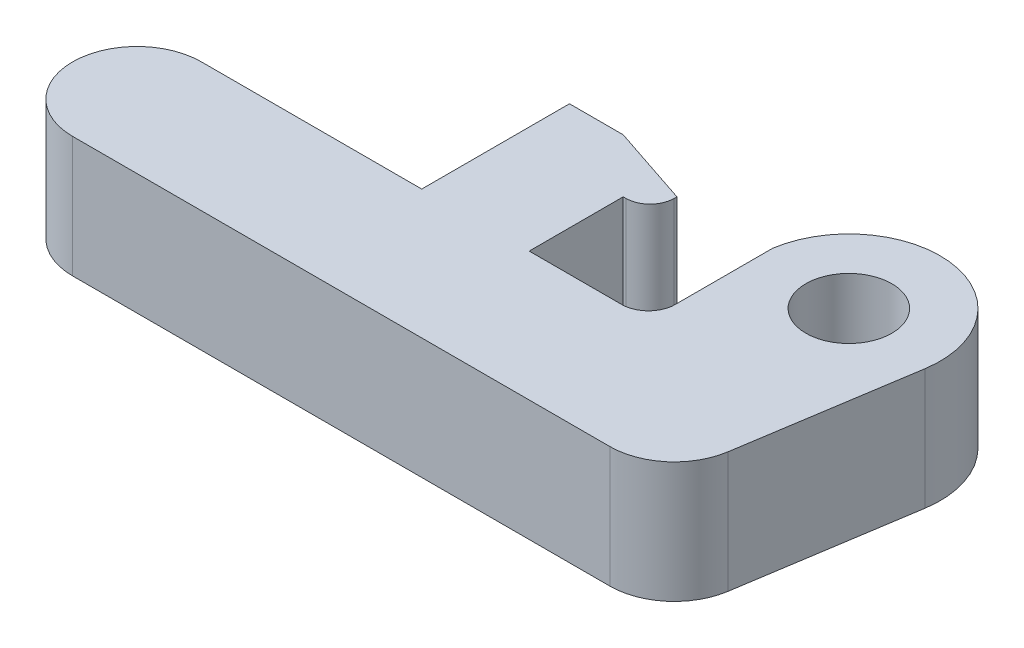
ISO-10303-21;
HEADER;
FILE_DESCRIPTION(('STEP AP214'),'2;1');
FILE_NAME('part.step','',(''),(''),'','','');
FILE_SCHEMA(('AUTOMOTIVE_DESIGN { 1 0 10303 214 1 1 1 1 }'));
ENDSEC;
DATA;
#1=APPLICATION_CONTEXT('core data for automotive mechanical design processes');
#2=APPLICATION_PROTOCOL_DEFINITION('international standard','automotive_design',2000,#1);
#3=PRODUCT_CONTEXT('',#1,'mechanical');
#4=PRODUCT('Part','Part','',(#3));
#5=PRODUCT_RELATED_PRODUCT_CATEGORY('part','',(#4));
#6=PRODUCT_DEFINITION_FORMATION('','',#4);
#7=PRODUCT_DEFINITION_CONTEXT('part definition',#1,'design');
#8=PRODUCT_DEFINITION('design','',#6,#7);
#9=PRODUCT_DEFINITION_SHAPE('','',#8);
#10=(LENGTH_UNIT() NAMED_UNIT(*) SI_UNIT(.MILLI.,.METRE.));
#11=(NAMED_UNIT(*) PLANE_ANGLE_UNIT() SI_UNIT($,.RADIAN.));
#12=(NAMED_UNIT(*) SI_UNIT($,.STERADIAN.) SOLID_ANGLE_UNIT());
#13=UNCERTAINTY_MEASURE_WITH_UNIT(LENGTH_MEASURE(1.E-05),#10,'distance_accuracy_value','');
#14=(GEOMETRIC_REPRESENTATION_CONTEXT(3) GLOBAL_UNCERTAINTY_ASSIGNED_CONTEXT((#13)) GLOBAL_UNIT_ASSIGNED_CONTEXT((#10,
#11,#12)) REPRESENTATION_CONTEXT('',''));
#15=CARTESIAN_POINT('',(0.,0.,0.));
#16=DIRECTION('',(0.,0.,1.));
#17=DIRECTION('',(1.,0.,0.));
#18=AXIS2_PLACEMENT_3D('',#15,#16,#17);
#19=CARTESIAN_POINT('',(0.,4.5,0.6));
#20=DIRECTION('',(0.,0.,-1.));
#21=DIRECTION('',(-1.,0.,0.));
#22=AXIS2_PLACEMENT_3D('',#19,#20,#21);
#23=PLANE('',#22);
#24=DIRECTION('',(1.,0.,0.));
#25=VECTOR('',#24,1.);
#26=CARTESIAN_POINT('',(0.,0.,0.6));
#27=LINE('',#26,#25);
#28=CARTESIAN_POINT('',(-7.8,0.,0.6));
#29=VERTEX_POINT('',#28);
#30=CARTESIAN_POINT('',(-7.7,0.,0.6));
#31=VERTEX_POINT('',#30);
#32=EDGE_CURVE('E257',#29,#31,#27,.T.);
#33=ORIENTED_EDGE('',*,*,#32,.T.);
#34=DIRECTION('',(0.,-1.,0.));
#35=VECTOR('',#34,1.);
#36=CARTESIAN_POINT('',(-7.7,4.5,0.6));
#37=LINE('',#36,#35);
#38=CARTESIAN_POINT('',(-7.7,4.5,0.6));
#39=VERTEX_POINT('',#38);
#40=EDGE_CURVE('E208',#39,#31,#37,.T.);
#41=ORIENTED_EDGE('',*,*,#40,.F.);
#42=DIRECTION('',(1.,0.,0.));
#43=VECTOR('',#42,1.);
#44=CARTESIAN_POINT('',(0.,4.5,0.6));
#45=LINE('',#44,#43);
#46=CARTESIAN_POINT('',(-7.8,4.5,0.6));
#47=VERTEX_POINT('',#46);
#48=EDGE_CURVE('E324',#47,#39,#45,.T.);
#49=ORIENTED_EDGE('',*,*,#48,.F.);
#50=DIRECTION('',(0.,-1.,0.));
#51=VECTOR('',#50,1.);
#52=CARTESIAN_POINT('',(-7.8,4.5,0.6));
#53=LINE('',#52,#51);
#54=EDGE_CURVE('E184',#47,#29,#53,.T.);
#55=ORIENTED_EDGE('',*,*,#54,.T.);
#56=EDGE_LOOP('',(#33,#41,#49,#55));
#57=FACE_BOUND('',#56,.T.);
#58=ADVANCED_FACE('F43',(#57),#23,.F.);
#59=CARTESIAN_POINT('',(-7.7,4.5,-0.3));
#60=DIRECTION('',(0.,-1.,0.));
#61=DIRECTION('',(0.,0.,-1.));
#62=AXIS2_PLACEMENT_3D('',#59,#60,#61);
#63=CYLINDRICAL_SURFACE('',#62,0.9);
#64=CARTESIAN_POINT('',(-7.7,0.,-0.3));
#65=DIRECTION('',(0.,1.,0.));
#66=DIRECTION('',(0.,0.,1.));
#67=AXIS2_PLACEMENT_3D('',#64,#65,#66);
#68=CIRCLE('',#67,0.9);
#69=CARTESIAN_POINT('',(-6.8,0.,-0.3));
#70=VERTEX_POINT('',#69);
#71=EDGE_CURVE('E259',#31,#70,#68,.T.);
#72=ORIENTED_EDGE('',*,*,#71,.T.);
#73=DIRECTION('',(0.,-1.,0.));
#74=VECTOR('',#73,1.);
#75=CARTESIAN_POINT('',(-6.8,4.5,-0.3));
#76=LINE('',#75,#74);
#77=CARTESIAN_POINT('',(-6.8,4.5,-0.3));
#78=VERTEX_POINT('',#77);
#79=EDGE_CURVE('E206',#78,#70,#76,.T.);
#80=ORIENTED_EDGE('',*,*,#79,.F.);
#81=CARTESIAN_POINT('',(-7.7,4.5,-0.3));
#82=DIRECTION('',(0.,1.,0.));
#83=DIRECTION('',(0.,0.,1.));
#84=AXIS2_PLACEMENT_3D('',#81,#82,#83);
#85=CIRCLE('',#84,0.9);
#86=EDGE_CURVE('E322',#39,#78,#85,.T.);
#87=ORIENTED_EDGE('',*,*,#86,.F.);
#88=ORIENTED_EDGE('',*,*,#40,.T.);
#89=EDGE_LOOP('',(#72,#80,#87,#88));
#90=FACE_BOUND('',#89,.T.);
#91=ADVANCED_FACE('F226',(#90),#63,.T.);
#92=CARTESIAN_POINT('',(-6.8,4.5,0.));
#93=DIRECTION('',(1.,0.,0.));
#94=DIRECTION('',(0.,0.,-1.));
#95=AXIS2_PLACEMENT_3D('',#92,#93,#94);
#96=PLANE('',#95);
#97=DIRECTION('',(0.,0.,1.));
#98=VECTOR('',#97,1.);
#99=CARTESIAN_POINT('',(-6.8,0.,0.));
#100=LINE('',#99,#98);
#101=CARTESIAN_POINT('',(-6.8,0.,-0.4));
#102=VERTEX_POINT('',#101);
#103=EDGE_CURVE('E267',#102,#70,#100,.T.);
#104=ORIENTED_EDGE('',*,*,#103,.F.);
#105=DIRECTION('',(0.,-1.,0.));
#106=VECTOR('',#105,1.);
#107=CARTESIAN_POINT('',(-6.8,4.5,-0.4));
#108=LINE('',#107,#106);
#109=CARTESIAN_POINT('',(-6.8,4.5,-0.4));
#110=VERTEX_POINT('',#109);
#111=EDGE_CURVE('E204',#110,#102,#108,.T.);
#112=ORIENTED_EDGE('',*,*,#111,.F.);
#113=DIRECTION('',(0.,0.,1.));
#114=VECTOR('',#113,1.);
#115=CARTESIAN_POINT('',(-6.8,4.5,0.));
#116=LINE('',#115,#114);
#117=EDGE_CURVE('E319',#110,#78,#116,.T.);
#118=ORIENTED_EDGE('',*,*,#117,.T.);
#119=ORIENTED_EDGE('',*,*,#79,.T.);
#120=EDGE_LOOP('',(#104,#112,#118,#119));
#121=FACE_BOUND('',#120,.T.);
#122=ADVANCED_FACE('F232',(#121),#96,.T.);
#123=CARTESIAN_POINT('',(-0.559999999999999,4.5,1.68));
#124=DIRECTION('',(0.316227766016838,0.,-0.948683298050514));
#125=DIRECTION('',(-0.948683298050514,0.,-0.316227766016838));
#126=AXIS2_PLACEMENT_3D('',#123,#124,#125);
#127=PLANE('',#126);
#128=DIRECTION('',(0.948683298050514,0.,0.316227766016838));
#129=VECTOR('',#128,1.);
#130=CARTESIAN_POINT('',(-0.559999999999999,0.,1.68));
#131=LINE('',#130,#129);
#132=CARTESIAN_POINT('',(-9.8,0.,-1.4));
#133=VERTEX_POINT('',#132);
#134=EDGE_CURVE('E270',#133,#102,#131,.T.);
#135=ORIENTED_EDGE('',*,*,#134,.F.);
#136=DIRECTION('',(0.,-1.,0.));
#137=VECTOR('',#136,1.);
#138=CARTESIAN_POINT('',(-9.8,4.5,-1.4));
#139=LINE('',#138,#137);
#140=CARTESIAN_POINT('',(-9.8,4.5,-1.4));
#141=VERTEX_POINT('',#140);
#142=EDGE_CURVE('E202',#141,#133,#139,.T.);
#143=ORIENTED_EDGE('',*,*,#142,.F.);
#144=DIRECTION('',(0.948683298050514,0.,0.316227766016838));
#145=VECTOR('',#144,1.);
#146=CARTESIAN_POINT('',(-0.559999999999999,4.5,1.68));
#147=LINE('',#146,#145);
#148=EDGE_CURVE('E316',#141,#110,#147,.T.);
#149=ORIENTED_EDGE('',*,*,#148,.T.);
#150=ORIENTED_EDGE('',*,*,#111,.T.);
#151=EDGE_LOOP('',(#135,#143,#149,#150));
#152=FACE_BOUND('',#151,.T.);
#153=ADVANCED_FACE('F334',(#152),#127,.T.);
#154=CARTESIAN_POINT('',(0.,4.5,-1.4));
#155=DIRECTION('',(0.,0.,1.));
#156=DIRECTION('',(1.,0.,0.));
#157=AXIS2_PLACEMENT_3D('',#154,#155,#156);
#158=PLANE('',#157);
#159=DIRECTION('',(-1.,0.,0.));
#160=VECTOR('',#159,1.);
#161=CARTESIAN_POINT('',(0.,0.,-1.4));
#162=LINE('',#161,#160);
#163=CARTESIAN_POINT('',(-11.8,0.,-1.4));
#164=VERTEX_POINT('',#163);
#165=EDGE_CURVE('E273',#133,#164,#162,.T.);
#166=ORIENTED_EDGE('',*,*,#165,.T.);
#167=DIRECTION('',(0.,-1.,0.));
#168=VECTOR('',#167,1.);
#169=CARTESIAN_POINT('',(-11.8,4.5,-1.4));
#170=LINE('',#169,#168);
#171=CARTESIAN_POINT('',(-11.8,4.5,-1.4));
#172=VERTEX_POINT('',#171);
#173=EDGE_CURVE('E199',#172,#164,#170,.T.);
#174=ORIENTED_EDGE('',*,*,#173,.F.);
#175=DIRECTION('',(-1.,0.,0.));
#176=VECTOR('',#175,1.);
#177=CARTESIAN_POINT('',(0.,4.5,-1.4));
#178=LINE('',#177,#176);
#179=EDGE_CURVE('E314',#141,#172,#178,.T.);
#180=ORIENTED_EDGE('',*,*,#179,.F.);
#181=ORIENTED_EDGE('',*,*,#142,.T.);
#182=EDGE_LOOP('',(#166,#174,#180,#181));
#183=FACE_BOUND('',#182,.T.);
#184=ADVANCED_FACE('F339',(#183),#158,.F.);
#185=CARTESIAN_POINT('',(-11.8,4.5,0.));
#186=DIRECTION('',(1.,0.,0.));
#187=DIRECTION('',(0.,0.,-1.));
#188=AXIS2_PLACEMENT_3D('',#185,#186,#187);
#189=PLANE('',#188);
#190=DIRECTION('',(0.,0.,1.));
#191=VECTOR('',#190,1.);
#192=CARTESIAN_POINT('',(-11.8,0.,0.));
#193=LINE('',#192,#191);
#194=CARTESIAN_POINT('',(-11.8,0.,4.1));
#195=VERTEX_POINT('',#194);
#196=EDGE_CURVE('E275',#164,#195,#193,.T.);
#197=ORIENTED_EDGE('',*,*,#196,.T.);
#198=DIRECTION('',(0.,-1.,0.));
#199=VECTOR('',#198,1.);
#200=CARTESIAN_POINT('',(-11.8,4.5,4.1));
#201=LINE('',#200,#199);
#202=CARTESIAN_POINT('',(-11.8,4.5,4.1));
#203=VERTEX_POINT('',#202);
#204=EDGE_CURVE('E196',#203,#195,#201,.T.);
#205=ORIENTED_EDGE('',*,*,#204,.F.);
#206=DIRECTION('',(0.,0.,1.));
#207=VECTOR('',#206,1.);
#208=CARTESIAN_POINT('',(-11.8,4.5,0.));
#209=LINE('',#208,#207);
#210=EDGE_CURVE('E312',#172,#203,#209,.T.);
#211=ORIENTED_EDGE('',*,*,#210,.F.);
#212=ORIENTED_EDGE('',*,*,#173,.T.);
#213=EDGE_LOOP('',(#197,#205,#211,#212));
#214=FACE_BOUND('',#213,.T.);
#215=ADVANCED_FACE('F345',(#214),#189,.F.);
#216=CARTESIAN_POINT('',(0.,4.5,4.1));
#217=DIRECTION('',(0.,0.,1.));
#218=DIRECTION('',(1.,0.,0.));
#219=AXIS2_PLACEMENT_3D('',#216,#217,#218);
#220=PLANE('',#219);
#221=DIRECTION('',(-1.,0.,0.));
#222=VECTOR('',#221,1.);
#223=CARTESIAN_POINT('',(0.,0.,4.1));
#224=LINE('',#223,#222);
#225=CARTESIAN_POINT('',(-20.,0.,4.1));
#226=VERTEX_POINT('',#225);
#227=EDGE_CURVE('E277',#195,#226,#224,.T.);
#228=ORIENTED_EDGE('',*,*,#227,.T.);
#229=DIRECTION('',(0.,-1.,0.));
#230=VECTOR('',#229,1.);
#231=CARTESIAN_POINT('',(-20.,4.5,4.1));
#232=LINE('',#231,#230);
#233=CARTESIAN_POINT('',(-20.,4.5,4.1));
#234=VERTEX_POINT('',#233);
#235=EDGE_CURVE('E193',#234,#226,#232,.T.);
#236=ORIENTED_EDGE('',*,*,#235,.F.);
#237=DIRECTION('',(-1.,0.,0.));
#238=VECTOR('',#237,1.);
#239=CARTESIAN_POINT('',(0.,4.5,4.1));
#240=LINE('',#239,#238);
#241=EDGE_CURVE('E310',#203,#234,#240,.T.);
#242=ORIENTED_EDGE('',*,*,#241,.F.);
#243=ORIENTED_EDGE('',*,*,#204,.T.);
#244=EDGE_LOOP('',(#228,#236,#242,#243));
#245=FACE_BOUND('',#244,.T.);
#246=ADVANCED_FACE('F349',(#245),#220,.F.);
#247=CARTESIAN_POINT('',(-20.,4.5,6.5));
#248=DIRECTION('',(0.,-1.,0.));
#249=DIRECTION('',(0.,0.,-1.));
#250=AXIS2_PLACEMENT_3D('',#247,#248,#249);
#251=CYLINDRICAL_SURFACE('',#250,2.4);
#252=CARTESIAN_POINT('',(-20.,0.,6.5));
#253=DIRECTION('',(0.,1.,0.));
#254=DIRECTION('',(0.,0.,1.));
#255=AXIS2_PLACEMENT_3D('',#252,#253,#254);
#256=CIRCLE('',#255,2.4);
#257=CARTESIAN_POINT('',(-20.,0.,8.9));
#258=VERTEX_POINT('',#257);
#259=EDGE_CURVE('E279',#226,#258,#256,.T.);
#260=ORIENTED_EDGE('',*,*,#259,.T.);
#261=DIRECTION('',(0.,-1.,0.));
#262=VECTOR('',#261,1.);
#263=CARTESIAN_POINT('',(-20.,4.5,8.9));
#264=LINE('',#263,#262);
#265=CARTESIAN_POINT('',(-20.,4.5,8.9));
#266=VERTEX_POINT('',#265);
#267=EDGE_CURVE('E191',#266,#258,#264,.T.);
#268=ORIENTED_EDGE('',*,*,#267,.F.);
#269=CARTESIAN_POINT('',(-20.,4.5,6.5));
#270=DIRECTION('',(0.,1.,0.));
#271=DIRECTION('',(0.,0.,1.));
#272=AXIS2_PLACEMENT_3D('',#269,#270,#271);
#273=CIRCLE('',#272,2.4);
#274=EDGE_CURVE('E308',#234,#266,#273,.T.);
#275=ORIENTED_EDGE('',*,*,#274,.F.);
#276=ORIENTED_EDGE('',*,*,#235,.T.);
#277=EDGE_LOOP('',(#260,#268,#275,#276));
#278=FACE_BOUND('',#277,.T.);
#279=ADVANCED_FACE('F354',(#278),#251,.T.);
#280=CARTESIAN_POINT('',(0.,4.5,8.9));
#281=DIRECTION('',(0.,0.,1.));
#282=DIRECTION('',(1.,0.,0.));
#283=AXIS2_PLACEMENT_3D('',#280,#281,#282);
#284=PLANE('',#283);
#285=DIRECTION('',(-1.,0.,0.));
#286=VECTOR('',#285,1.);
#287=CARTESIAN_POINT('',(0.,0.,8.9));
#288=LINE('',#287,#286);
#289=CARTESIAN_POINT('',(0.,0.,8.9));
#290=VERTEX_POINT('',#289);
#291=EDGE_CURVE('E282',#290,#258,#288,.T.);
#292=ORIENTED_EDGE('',*,*,#291,.F.);
#293=DIRECTION('',(0.,-1.,0.));
#294=VECTOR('',#293,1.);
#295=CARTESIAN_POINT('',(0.,4.5,8.9));
#296=LINE('',#295,#294);
#297=CARTESIAN_POINT('',(0.,4.5,8.9));
#298=VERTEX_POINT('',#297);
#299=EDGE_CURVE('E189',#298,#290,#296,.T.);
#300=ORIENTED_EDGE('',*,*,#299,.F.);
#301=DIRECTION('',(-1.,0.,0.));
#302=VECTOR('',#301,1.);
#303=CARTESIAN_POINT('',(0.,4.5,8.9));
#304=LINE('',#303,#302);
#305=EDGE_CURVE('E305',#298,#266,#304,.T.);
#306=ORIENTED_EDGE('',*,*,#305,.T.);
#307=ORIENTED_EDGE('',*,*,#267,.T.);
#308=EDGE_LOOP('',(#292,#300,#306,#307));
#309=FACE_BOUND('',#308,.T.);
#310=ADVANCED_FACE('F360',(#309),#284,.T.);
#311=CARTESIAN_POINT('',(0.,4.5,6.5));
#312=DIRECTION('',(0.,-1.,0.));
#313=DIRECTION('',(0.,0.,-1.));
#314=AXIS2_PLACEMENT_3D('',#311,#312,#313);
#315=CYLINDRICAL_SURFACE('',#314,2.4);
#316=CARTESIAN_POINT('',(0.,0.,6.5));
#317=DIRECTION('',(0.,1.,0.));
#318=DIRECTION('',(0.,0.,1.));
#319=AXIS2_PLACEMENT_3D('',#316,#317,#318);
#320=CIRCLE('',#319,2.4);
#321=CARTESIAN_POINT('',(2.37142755298433,0.,6.86923076923077));
#322=VERTEX_POINT('',#321);
#323=EDGE_CURVE('E285',#290,#322,#320,.T.);
#324=ORIENTED_EDGE('',*,*,#323,.T.);
#325=DIRECTION('',(0.,-1.,0.));
#326=VECTOR('',#325,1.);
#327=CARTESIAN_POINT('',(2.37142755298433,4.5,6.86923076923077));
#328=LINE('',#327,#326);
#329=CARTESIAN_POINT('',(2.37142755298433,4.5,6.86923076923077));
#330=VERTEX_POINT('',#329);
#331=EDGE_CURVE('E181',#330,#322,#328,.T.);
#332=ORIENTED_EDGE('',*,*,#331,.F.);
#333=CARTESIAN_POINT('',(0.,4.5,6.5));
#334=DIRECTION('',(0.,1.,0.));
#335=DIRECTION('',(0.,0.,1.));
#336=AXIS2_PLACEMENT_3D('',#333,#334,#335);
#337=CIRCLE('',#336,2.4);
#338=EDGE_CURVE('E303',#298,#330,#337,.T.);
#339=ORIENTED_EDGE('',*,*,#338,.F.);
#340=ORIENTED_EDGE('',*,*,#299,.T.);
#341=EDGE_LOOP('',(#324,#332,#339,#340));
#342=FACE_BOUND('',#341,.T.);
#343=ADVANCED_FACE('F363',(#342),#315,.T.);
#344=CARTESIAN_POINT('',(3.3595223667278,4.5,0.523076923076922));
#345=DIRECTION('',(0.988094813743472,0.,0.153846153846154));
#346=DIRECTION('',(0.153846153846154,0.,-0.988094813743472));
#347=AXIS2_PLACEMENT_3D('',#344,#345,#346);
#348=PLANE('',#347);
#349=DIRECTION('',(-0.153846153846154,0.,0.988094813743472));
#350=VECTOR('',#349,1.);
#351=CARTESIAN_POINT('',(3.3595223667278,0.,0.523076923076922));
#352=LINE('',#351,#350);
#353=CARTESIAN_POINT('',(3.3595223667278,0.,0.523076923076923));
#354=VERTEX_POINT('',#353);
#355=EDGE_CURVE('E288',#354,#322,#352,.T.);
#356=ORIENTED_EDGE('',*,*,#355,.F.);
#357=DIRECTION('',(0.,-1.,0.));
#358=VECTOR('',#357,1.);
#359=CARTESIAN_POINT('',(3.3595223667278,4.5,0.523076923076923));
#360=LINE('',#359,#358);
#361=CARTESIAN_POINT('',(3.3595223667278,4.5,0.523076923076923));
#362=VERTEX_POINT('',#361);
#363=EDGE_CURVE('E178',#362,#354,#360,.T.);
#364=ORIENTED_EDGE('',*,*,#363,.F.);
#365=DIRECTION('',(-0.153846153846154,0.,0.988094813743472));
#366=VECTOR('',#365,1.);
#367=CARTESIAN_POINT('',(3.3595223667278,4.5,0.523076923076922));
#368=LINE('',#367,#366);
#369=EDGE_CURVE('E171',#362,#330,#368,.T.);
#370=ORIENTED_EDGE('',*,*,#369,.T.);
#371=ORIENTED_EDGE('',*,*,#331,.T.);
#372=EDGE_LOOP('',(#356,#364,#370,#371));
#373=FACE_BOUND('',#372,.T.);
#374=ADVANCED_FACE('F365',(#373),#348,.T.);
#375=CARTESIAN_POINT('',(0.,4.5,0.));
#376=DIRECTION('',(0.,-1.,0.));
#377=DIRECTION('',(0.,0.,-1.));
#378=AXIS2_PLACEMENT_3D('',#375,#376,#377);
#379=CYLINDRICAL_SURFACE('',#378,3.4);
#380=CARTESIAN_POINT('',(0.,0.,0.));
#381=DIRECTION('',(0.,1.,0.));
#382=DIRECTION('',(0.,0.,1.));
#383=AXIS2_PLACEMENT_3D('',#380,#381,#382);
#384=CIRCLE('',#383,3.4);
#385=CARTESIAN_POINT('',(-3.3595223667278,0.,-0.523076923076923));
#386=VERTEX_POINT('',#385);
#387=EDGE_CURVE('E177',#354,#386,#384,.T.);
#388=ORIENTED_EDGE('',*,*,#387,.T.);
#389=DIRECTION('',(0.,-1.,0.));
#390=VECTOR('',#389,1.);
#391=CARTESIAN_POINT('',(-3.3595223667278,4.5,-0.523076923076923));
#392=LINE('',#391,#390);
#393=CARTESIAN_POINT('',(-3.3595223667278,4.5,-0.523076923076923));
#394=VERTEX_POINT('',#393);
#395=EDGE_CURVE('E159',#394,#386,#392,.T.);
#396=ORIENTED_EDGE('',*,*,#395,.F.);
#397=CARTESIAN_POINT('',(0.,4.5,0.));
#398=DIRECTION('',(0.,1.,0.));
#399=DIRECTION('',(0.,0.,1.));
#400=AXIS2_PLACEMENT_3D('',#397,#398,#399);
#401=CIRCLE('',#400,3.4);
#402=EDGE_CURVE('E167',#362,#394,#401,.T.);
#403=ORIENTED_EDGE('',*,*,#402,.F.);
#404=ORIENTED_EDGE('',*,*,#363,.T.);
#405=EDGE_LOOP('',(#388,#396,#403,#404));
#406=FACE_BOUND('',#405,.T.);
#407=ADVANCED_FACE('F175',(#406),#379,.T.);
#408=CARTESIAN_POINT('',(0.,4.5,4.1));
#409=DIRECTION('',(0.,0.,1.));
#410=DIRECTION('',(1.,0.,0.));
#411=AXIS2_PLACEMENT_3D('',#408,#409,#410);
#412=PLANE('',#411);
#413=DIRECTION('',(-1.,0.,0.));
#414=VECTOR('',#413,1.);
#415=CARTESIAN_POINT('',(0.,4.5,4.1));
#416=LINE('',#415,#414);
#417=CARTESIAN_POINT('',(-4.3595223667278,4.5,4.1));
#418=VERTEX_POINT('',#417);
#419=CARTESIAN_POINT('',(-7.8,4.5,4.1));
#420=VERTEX_POINT('',#419);
#421=EDGE_CURVE('E173',#418,#420,#416,.T.);
#422=ORIENTED_EDGE('',*,*,#421,.F.);
#423=DIRECTION('',(0.,1.,0.));
#424=VECTOR('',#423,1.);
#425=CARTESIAN_POINT('',(-4.3595223667278,0.,4.1));
#426=LINE('',#425,#424);
#427=CARTESIAN_POINT('',(-4.3595223667278,0.,4.1));
#428=VERTEX_POINT('',#427);
#429=EDGE_CURVE('E64',#418,#428,#426,.F.);
#430=ORIENTED_EDGE('',*,*,#429,.T.);
#431=DIRECTION('',(-1.,0.,0.));
#432=VECTOR('',#431,1.);
#433=CARTESIAN_POINT('',(0.,0.,4.1));
#434=LINE('',#433,#432);
#435=CARTESIAN_POINT('',(-7.8,0.,4.1));
#436=VERTEX_POINT('',#435);
#437=EDGE_CURVE('E291',#428,#436,#434,.T.);
#438=ORIENTED_EDGE('',*,*,#437,.T.);
#439=DIRECTION('',(0.,-1.,0.));
#440=VECTOR('',#439,1.);
#441=CARTESIAN_POINT('',(-7.8,4.5,4.1));
#442=LINE('',#441,#440);
#443=EDGE_CURVE('E179',#420,#436,#442,.T.);
#444=ORIENTED_EDGE('',*,*,#443,.F.);
#445=EDGE_LOOP('',(#422,#430,#438,#444));
#446=FACE_BOUND('',#445,.T.);
#447=ADVANCED_FACE('F240',(#446),#412,.F.);
#448=CARTESIAN_POINT('',(0.,4.5,0.));
#449=DIRECTION('',(0.,-1.,0.));
#450=DIRECTION('',(0.,0.,-1.));
#451=AXIS2_PLACEMENT_3D('',#448,#449,#450);
#452=CYLINDRICAL_SURFACE('',#451,1.6);
#453=CARTESIAN_POINT('',(0.,4.5,0.));
#454=DIRECTION('',(0.,1.,0.));
#455=DIRECTION('',(0.,0.,1.));
#456=AXIS2_PLACEMENT_3D('',#453,#454,#455);
#457=CIRCLE('',#456,1.6);
#458=CARTESIAN_POINT('',(0.,4.5,1.6));
#459=VERTEX_POINT('',#458);
#460=EDGE_CURVE('E253',#459,#459,#457,.T.);
#461=ORIENTED_EDGE('',*,*,#460,.T.);
#462=EDGE_LOOP('',(#461));
#463=FACE_BOUND('',#462,.T.);
#464=CARTESIAN_POINT('',(0.,0.,0.));
#465=DIRECTION('',(0.,1.,0.));
#466=DIRECTION('',(0.,0.,1.));
#467=AXIS2_PLACEMENT_3D('',#464,#465,#466);
#468=CIRCLE('',#467,1.6);
#469=CARTESIAN_POINT('',(0.,0.,1.6));
#470=VERTEX_POINT('',#469);
#471=EDGE_CURVE('E163',#470,#470,#468,.T.);
#472=ORIENTED_EDGE('',*,*,#471,.F.);
#473=EDGE_LOOP('',(#472));
#474=FACE_BOUND('',#473,.T.);
#475=ADVANCED_FACE('F237',(#463,#474),#452,.F.);
#476=CARTESIAN_POINT('',(-7.8,4.5,0.));
#477=DIRECTION('',(-1.,0.,0.));
#478=DIRECTION('',(0.,0.,1.));
#479=AXIS2_PLACEMENT_3D('',#476,#477,#478);
#480=PLANE('',#479);
#481=DIRECTION('',(0.,0.,-1.));
#482=VECTOR('',#481,1.);
#483=CARTESIAN_POINT('',(-7.8,0.,0.));
#484=LINE('',#483,#482);
#485=EDGE_CURVE('E293',#436,#29,#484,.T.);
#486=ORIENTED_EDGE('',*,*,#485,.T.);
#487=ORIENTED_EDGE('',*,*,#54,.F.);
#488=DIRECTION('',(0.,0.,-1.));
#489=VECTOR('',#488,1.);
#490=CARTESIAN_POINT('',(-7.8,4.5,0.));
#491=LINE('',#490,#489);
#492=EDGE_CURVE('E262',#420,#47,#491,.T.);
#493=ORIENTED_EDGE('',*,*,#492,.F.);
#494=ORIENTED_EDGE('',*,*,#443,.T.);
#495=EDGE_LOOP('',(#486,#487,#493,#494));
#496=FACE_BOUND('',#495,.T.);
#497=ADVANCED_FACE('F239',(#496),#480,.F.);
#498=CARTESIAN_POINT('',(0.,4.5,0.));
#499=DIRECTION('',(0.,1.,0.));
#500=DIRECTION('',(0.,0.,1.));
#501=AXIS2_PLACEMENT_3D('',#498,#499,#500);
#502=PLANE('',#501);
#503=DIRECTION('',(0.,0.,-1.));
#504=VECTOR('',#503,1.);
#505=CARTESIAN_POINT('',(-3.3595223667278,4.5,-0.523076923076923));
#506=LINE('',#505,#504);
#507=CARTESIAN_POINT('',(-3.3595223667278,4.5,3.1));
#508=VERTEX_POINT('',#507);
#509=EDGE_CURVE('E154',#508,#394,#506,.T.);
#510=ORIENTED_EDGE('',*,*,#509,.F.);
#511=CARTESIAN_POINT('',(-4.3595223667278,4.5,3.1));
#512=DIRECTION('',(0.,1.,0.));
#513=DIRECTION('',(0.,0.,1.));
#514=AXIS2_PLACEMENT_3D('',#511,#512,#513);
#515=CIRCLE('',#514,1.);
#516=EDGE_CURVE('E51',#508,#418,#515,.F.);
#517=ORIENTED_EDGE('',*,*,#516,.T.);
#518=ORIENTED_EDGE('',*,*,#421,.T.);
#519=ORIENTED_EDGE('',*,*,#492,.T.);
#520=ORIENTED_EDGE('',*,*,#48,.T.);
#521=ORIENTED_EDGE('',*,*,#86,.T.);
#522=ORIENTED_EDGE('',*,*,#117,.F.);
#523=ORIENTED_EDGE('',*,*,#148,.F.);
#524=ORIENTED_EDGE('',*,*,#179,.T.);
#525=ORIENTED_EDGE('',*,*,#210,.T.);
#526=ORIENTED_EDGE('',*,*,#241,.T.);
#527=ORIENTED_EDGE('',*,*,#274,.T.);
#528=ORIENTED_EDGE('',*,*,#305,.F.);
#529=ORIENTED_EDGE('',*,*,#338,.T.);
#530=ORIENTED_EDGE('',*,*,#369,.F.);
#531=ORIENTED_EDGE('',*,*,#402,.T.);
#532=EDGE_LOOP('',(#510,#517,#518,#519,#520,#521,#522,#523,#524,#525,#526,#527,#528,#529,#530,#531));
#533=FACE_BOUND('',#532,.T.);
#534=ORIENTED_EDGE('',*,*,#460,.F.);
#535=EDGE_LOOP('',(#534));
#536=FACE_BOUND('',#535,.T.);
#537=ADVANCED_FACE('F168',(#533,#536),#502,.T.);
#538=CARTESIAN_POINT('',(0.,0.,0.));
#539=DIRECTION('',(0.,1.,0.));
#540=DIRECTION('',(0.,0.,1.));
#541=AXIS2_PLACEMENT_3D('',#538,#539,#540);
#542=PLANE('',#541);
#543=ORIENTED_EDGE('',*,*,#471,.T.);
#544=EDGE_LOOP('',(#543));
#545=FACE_BOUND('',#544,.T.);
#546=ORIENTED_EDGE('',*,*,#437,.F.);
#547=CARTESIAN_POINT('',(-4.3595223667278,0.,3.1));
#548=DIRECTION('',(0.,1.,0.));
#549=DIRECTION('',(0.,0.,1.));
#550=AXIS2_PLACEMENT_3D('',#547,#548,#549);
#551=CIRCLE('',#550,1.);
#552=CARTESIAN_POINT('',(-3.3595223667278,0.,3.1));
#553=VERTEX_POINT('',#552);
#554=EDGE_CURVE('E11',#428,#553,#551,.T.);
#555=ORIENTED_EDGE('',*,*,#554,.T.);
#556=DIRECTION('',(0.,0.,-1.));
#557=VECTOR('',#556,1.);
#558=CARTESIAN_POINT('',(-3.3595223667278,0.,0.));
#559=LINE('',#558,#557);
#560=EDGE_CURVE('E211',#553,#386,#559,.T.);
#561=ORIENTED_EDGE('',*,*,#560,.T.);
#562=ORIENTED_EDGE('',*,*,#387,.F.);
#563=ORIENTED_EDGE('',*,*,#355,.T.);
#564=ORIENTED_EDGE('',*,*,#323,.F.);
#565=ORIENTED_EDGE('',*,*,#291,.T.);
#566=ORIENTED_EDGE('',*,*,#259,.F.);
#567=ORIENTED_EDGE('',*,*,#227,.F.);
#568=ORIENTED_EDGE('',*,*,#196,.F.);
#569=ORIENTED_EDGE('',*,*,#165,.F.);
#570=ORIENTED_EDGE('',*,*,#134,.T.);
#571=ORIENTED_EDGE('',*,*,#103,.T.);
#572=ORIENTED_EDGE('',*,*,#71,.F.);
#573=ORIENTED_EDGE('',*,*,#32,.F.);
#574=ORIENTED_EDGE('',*,*,#485,.F.);
#575=EDGE_LOOP('',(#546,#555,#561,#562,#563,#564,#565,#566,#567,#568,#569,#570,#571,#572,#573,#574));
#576=FACE_BOUND('',#575,.T.);
#577=ADVANCED_FACE('F215',(#545,#576),#542,.F.);
#578=CARTESIAN_POINT('',(-3.3595223667278,-5.5,-0.523076923076923));
#579=DIRECTION('',(1.,0.,0.));
#580=DIRECTION('',(0.,0.,-1.));
#581=AXIS2_PLACEMENT_3D('',#578,#579,#580);
#582=PLANE('',#581);
#583=ORIENTED_EDGE('',*,*,#560,.F.);
#584=DIRECTION('',(0.,1.,0.));
#585=VECTOR('',#584,1.);
#586=CARTESIAN_POINT('',(-3.3595223667278,4.5,3.1));
#587=LINE('',#586,#585);
#588=EDGE_CURVE('E162',#553,#508,#587,.T.);
#589=ORIENTED_EDGE('',*,*,#588,.T.);
#590=ORIENTED_EDGE('',*,*,#509,.T.);
#591=ORIENTED_EDGE('',*,*,#395,.T.);
#592=EDGE_LOOP('',(#583,#589,#590,#591));
#593=FACE_BOUND('',#592,.T.);
#594=ADVANCED_FACE('F157',(#593),#582,.F.);
#595=CARTESIAN_POINT('',(-4.3595223667278,-5.5,3.1));
#596=DIRECTION('',(0.,-1.,0.));
#597=DIRECTION('',(0.,0.,-1.));
#598=AXIS2_PLACEMENT_3D('',#595,#596,#597);
#599=CYLINDRICAL_SURFACE('',#598,1.);
#600=ORIENTED_EDGE('',*,*,#554,.F.);
#601=ORIENTED_EDGE('',*,*,#429,.F.);
#602=ORIENTED_EDGE('',*,*,#516,.F.);
#603=ORIENTED_EDGE('',*,*,#588,.F.);
#604=EDGE_LOOP('',(#600,#601,#602,#603));
#605=FACE_BOUND('',#604,.T.);
#606=ADVANCED_FACE('F45',(#605),#599,.F.);
#607=CLOSED_SHELL('',(#58,#91,#122,#153,#184,#215,#246,#279,#310,#343,#374,#407,#447,#475,#497,
#537,#577,#594,#606));
#608=MANIFOLD_SOLID_BREP('B2',#607);
#609=ADVANCED_BREP_SHAPE_REPRESENTATION('',(#18,#608),#14);
#610=SHAPE_DEFINITION_REPRESENTATION(#9,#609);
ENDSEC;
END-ISO-10303-21;
